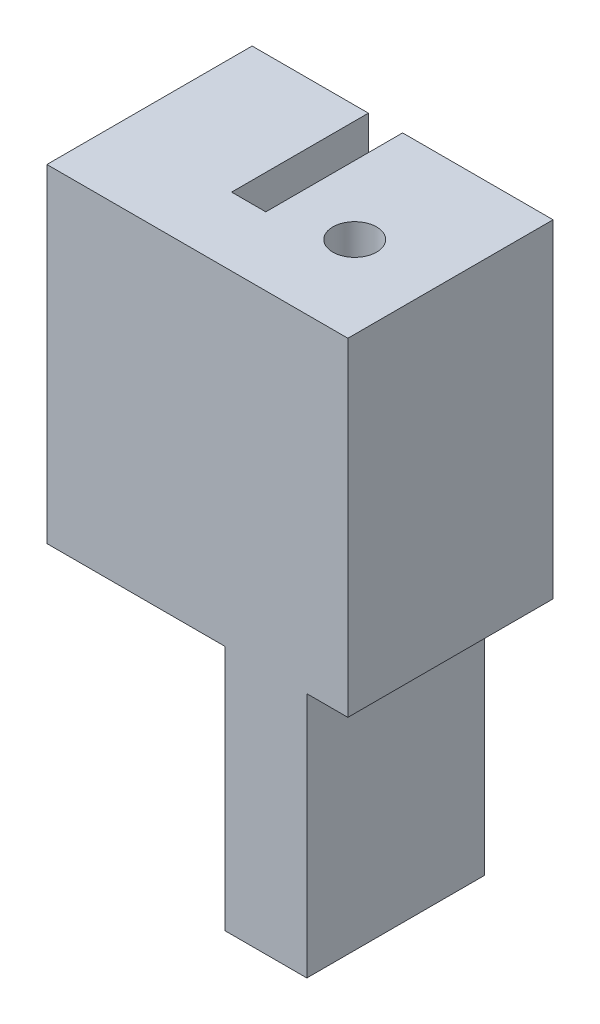
ISO-10303-21;
HEADER;
FILE_DESCRIPTION(('STEP AP214'),'2;1');
FILE_NAME('part.step','',(''),(''),'','','');
FILE_SCHEMA(('AUTOMOTIVE_DESIGN { 1 0 10303 214 1 1 1 1 }'));
ENDSEC;
DATA;
#1=APPLICATION_CONTEXT('core data for automotive mechanical design processes');
#2=APPLICATION_PROTOCOL_DEFINITION('international standard','automotive_design',2000,#1);
#3=PRODUCT_CONTEXT('',#1,'mechanical');
#4=PRODUCT('Part','Part','',(#3));
#5=PRODUCT_RELATED_PRODUCT_CATEGORY('part','',(#4));
#6=PRODUCT_DEFINITION_FORMATION('','',#4);
#7=PRODUCT_DEFINITION_CONTEXT('part definition',#1,'design');
#8=PRODUCT_DEFINITION('design','',#6,#7);
#9=PRODUCT_DEFINITION_SHAPE('','',#8);
#10=(LENGTH_UNIT() NAMED_UNIT(*) SI_UNIT(.MILLI.,.METRE.));
#11=(NAMED_UNIT(*) PLANE_ANGLE_UNIT() SI_UNIT($,.RADIAN.));
#12=(NAMED_UNIT(*) SI_UNIT($,.STERADIAN.) SOLID_ANGLE_UNIT());
#13=UNCERTAINTY_MEASURE_WITH_UNIT(LENGTH_MEASURE(1.E-05),#10,'distance_accuracy_value','');
#14=(GEOMETRIC_REPRESENTATION_CONTEXT(3) GLOBAL_UNCERTAINTY_ASSIGNED_CONTEXT((#13)) GLOBAL_UNIT_ASSIGNED_CONTEXT((#10,
#11,#12)) REPRESENTATION_CONTEXT('',''));
#15=CARTESIAN_POINT('',(0.,0.,0.));
#16=DIRECTION('',(0.,0.,1.));
#17=DIRECTION('',(1.,0.,0.));
#18=AXIS2_PLACEMENT_3D('',#15,#16,#17);
#19=CARTESIAN_POINT('',(-23.5,24.,8.5));
#20=DIRECTION('',(0.,-1.,0.));
#21=DIRECTION('',(0.,0.,-1.));
#22=AXIS2_PLACEMENT_3D('',#19,#20,#21);
#23=CYLINDRICAL_SURFACE('',#22,1.6);
#24=CARTESIAN_POINT('',(-23.5,4.64999999999999,8.5));
#25=DIRECTION('',(0.,1.,0.));
#26=DIRECTION('',(-1.,0.,0.));
#27=AXIS2_PLACEMENT_3D('',#24,#25,#26);
#28=CIRCLE('',#27,1.6);
#29=CARTESIAN_POINT('',(-25.1,4.64999999999999,8.5));
#30=VERTEX_POINT('',#29);
#31=EDGE_CURVE('E39',#30,#30,#28,.F.);
#32=ORIENTED_EDGE('',*,*,#31,.T.);
#33=EDGE_LOOP('',(#32));
#34=FACE_BOUND('',#33,.T.);
#35=CARTESIAN_POINT('',(-23.5,24.,8.5));
#36=DIRECTION('',(0.,-1.,0.));
#37=DIRECTION('',(0.,0.,-1.));
#38=AXIS2_PLACEMENT_3D('',#35,#36,#37);
#39=CIRCLE('',#38,1.6);
#40=CARTESIAN_POINT('',(-23.5,24.,6.9));
#41=VERTEX_POINT('',#40);
#42=EDGE_CURVE('E256',#41,#41,#39,.T.);
#43=ORIENTED_EDGE('',*,*,#42,.F.);
#44=EDGE_LOOP('',(#43));
#45=FACE_BOUND('',#44,.T.);
#46=ADVANCED_FACE('F35',(#34,#45),#23,.F.);
#47=CARTESIAN_POINT('',(-26.5,-18.,2.));
#48=DIRECTION('',(0.,0.,-1.));
#49=DIRECTION('',(-1.,0.,0.));
#50=AXIS2_PLACEMENT_3D('',#47,#48,#49);
#51=PLANE('',#50);
#52=DIRECTION('',(0.,1.,0.));
#53=VECTOR('',#52,1.);
#54=CARTESIAN_POINT('',(-26.5,-18.,2.));
#55=LINE('',#54,#53);
#56=CARTESIAN_POINT('',(-26.5,-18.,2.));
#57=VERTEX_POINT('',#56);
#58=CARTESIAN_POINT('',(-26.5,0.,2.));
#59=VERTEX_POINT('',#58);
#60=EDGE_CURVE('E276',#57,#59,#55,.T.);
#61=ORIENTED_EDGE('',*,*,#60,.T.);
#62=DIRECTION('',(-1.,0.,0.));
#63=VECTOR('',#62,1.);
#64=CARTESIAN_POINT('',(-26.5,0.,2.));
#65=LINE('',#64,#63);
#66=CARTESIAN_POINT('',(-20.5,0.,2.));
#67=VERTEX_POINT('',#66);
#68=EDGE_CURVE('E259',#67,#59,#65,.T.);
#69=ORIENTED_EDGE('',*,*,#68,.F.);
#70=DIRECTION('',(0.,1.,0.));
#71=VECTOR('',#70,1.);
#72=CARTESIAN_POINT('',(-20.5,-18.,2.));
#73=LINE('',#72,#71);
#74=CARTESIAN_POINT('',(-20.5,-18.,2.));
#75=VERTEX_POINT('',#74);
#76=EDGE_CURVE('E280',#75,#67,#73,.T.);
#77=ORIENTED_EDGE('',*,*,#76,.F.);
#78=DIRECTION('',(-1.,0.,0.));
#79=VECTOR('',#78,1.);
#80=CARTESIAN_POINT('',(-26.5,-18.,2.));
#81=LINE('',#80,#79);
#82=EDGE_CURVE('E272',#75,#57,#81,.T.);
#83=ORIENTED_EDGE('',*,*,#82,.T.);
#84=EDGE_LOOP('',(#61,#69,#77,#83));
#85=FACE_BOUND('',#84,.T.);
#86=ADVANCED_FACE('F424',(#85),#51,.T.);
#87=CARTESIAN_POINT('',(0.,0.,10.));
#88=DIRECTION('',(0.,0.,-1.));
#89=DIRECTION('',(-1.,0.,0.));
#90=AXIS2_PLACEMENT_3D('',#87,#88,#89);
#91=PLANE('',#90);
#92=DIRECTION('',(0.890531972902746,0.454920658178921,0.));
#93=VECTOR('',#92,1.);
#94=CARTESIAN_POINT('',(-31.,13.19,10.));
#95=LINE('',#94,#93);
#96=CARTESIAN_POINT('',(-36.71,10.2730952315675,10.));
#97=VERTEX_POINT('',#96);
#98=CARTESIAN_POINT('',(-31.,13.19,10.));
#99=VERTEX_POINT('',#98);
#100=EDGE_CURVE('E320',#97,#99,#95,.T.);
#101=ORIENTED_EDGE('',*,*,#100,.T.);
#102=DIRECTION('',(0.,1.,0.));
#103=VECTOR('',#102,1.);
#104=CARTESIAN_POINT('',(-31.,24.,10.));
#105=LINE('',#104,#103);
#106=CARTESIAN_POINT('',(-31.,24.,10.));
#107=VERTEX_POINT('',#106);
#108=EDGE_CURVE('E310',#99,#107,#105,.T.);
#109=ORIENTED_EDGE('',*,*,#108,.T.);
#110=DIRECTION('',(-1.,0.,0.));
#111=VECTOR('',#110,1.);
#112=CARTESIAN_POINT('',(-26.5,24.,10.));
#113=LINE('',#112,#111);
#114=CARTESIAN_POINT('',(-28.5,24.,10.));
#115=VERTEX_POINT('',#114);
#116=EDGE_CURVE('E350',#115,#107,#113,.T.);
#117=ORIENTED_EDGE('',*,*,#116,.F.);
#118=DIRECTION('',(0.,-1.,0.));
#119=VECTOR('',#118,1.);
#120=CARTESIAN_POINT('',(-28.5,24.,10.));
#121=LINE('',#120,#119);
#122=CARTESIAN_POINT('',(-28.5,6.02762910915523,10.));
#123=VERTEX_POINT('',#122);
#124=EDGE_CURVE('E371',#115,#123,#121,.T.);
#125=ORIENTED_EDGE('',*,*,#124,.T.);
#126=CARTESIAN_POINT('',(-34.5,6.02762910915523,10.));
#127=DIRECTION('',(0.,0.,-1.));
#128=DIRECTION('',(1.,0.,0.));
#129=AXIS2_PLACEMENT_3D('',#126,#127,#128);
#130=CIRCLE('',#129,6.);
#131=CARTESIAN_POINT('',(-31.0158371040724,1.14289688367537,10.));
#132=VERTEX_POINT('',#131);
#133=EDGE_CURVE('E374',#123,#132,#130,.T.);
#134=ORIENTED_EDGE('',*,*,#133,.T.);
#135=DIRECTION('',(-0.814122037579976,-0.580693815987933,0.));
#136=VECTOR('',#135,1.);
#137=CARTESIAN_POINT('',(-31.0158371040724,1.14289688367537,10.));
#138=LINE('',#137,#136);
#139=CARTESIAN_POINT('',(-32.618157490589,0.,10.));
#140=VERTEX_POINT('',#139);
#141=EDGE_CURVE('E378',#132,#140,#138,.T.);
#142=ORIENTED_EDGE('',*,*,#141,.T.);
#143=DIRECTION('',(1.,0.,0.));
#144=VECTOR('',#143,1.);
#145=CARTESIAN_POINT('',(-26.5,0.,10.));
#146=LINE('',#145,#144);
#147=CARTESIAN_POINT('',(-39.5,0.,10.));
#148=VERTEX_POINT('',#147);
#149=EDGE_CURVE('E354',#148,#140,#146,.T.);
#150=ORIENTED_EDGE('',*,*,#149,.F.);
#151=DIRECTION('',(0.,-1.,0.));
#152=VECTOR('',#151,1.);
#153=CARTESIAN_POINT('',(-39.5,24.,10.));
#154=LINE('',#153,#152);
#155=CARTESIAN_POINT('',(-39.5,6.3625514944793,10.));
#156=VERTEX_POINT('',#155);
#157=EDGE_CURVE('E362',#156,#148,#154,.T.);
#158=ORIENTED_EDGE('',*,*,#157,.F.);
#159=DIRECTION('',(0.434665046367225,0.900592192652467,0.));
#160=VECTOR('',#159,1.);
#161=CARTESIAN_POINT('',(-38.4926861378942,8.4496275254254,10.));
#162=LINE('',#161,#160);
#163=CARTESIAN_POINT('',(-38.4926861378942,8.4496275254254,10.));
#164=VERTEX_POINT('',#163);
#165=EDGE_CURVE('E313',#156,#164,#162,.T.);
#166=ORIENTED_EDGE('',*,*,#165,.T.);
#167=CARTESIAN_POINT('',(-34.8903173672843,6.71096733995649,10.));
#168=DIRECTION('',(0.,0.,-1.));
#169=DIRECTION('',(1.,0.,0.));
#170=AXIS2_PLACEMENT_3D('',#167,#168,#169);
#171=CIRCLE('',#170,4.);
#172=EDGE_CURVE('E317',#164,#97,#171,.T.);
#173=ORIENTED_EDGE('',*,*,#172,.T.);
#174=EDGE_LOOP('',(#101,#109,#117,#125,#134,#142,#150,#158,#166,#173));
#175=FACE_BOUND('',#174,.T.);
#176=DIRECTION('',(-0.890531972902747,-0.45492065817892,0.));
#177=VECTOR('',#176,1.);
#178=CARTESIAN_POINT('',(-30.2,11.6897018477597,10.));
#179=LINE('',#178,#177);
#180=CARTESIAN_POINT('',(-30.2,11.6897018477597,10.));
#181=VERTEX_POINT('',#180);
#182=CARTESIAN_POINT('',(-35.6850508813345,8.88771041678606,10.));
#183=VERTEX_POINT('',#182);
#184=EDGE_CURVE('E293',#181,#183,#179,.T.);
#185=ORIENTED_EDGE('',*,*,#184,.T.);
#186=CARTESIAN_POINT('',(-33.97,5.5304048789427,10.));
#187=DIRECTION('',(0.,0.,1.));
#188=DIRECTION('',(1.,0.,0.));
#189=AXIS2_PLACEMENT_3D('',#186,#187,#188);
#190=CIRCLE('',#189,3.77000000000001);
#191=CARTESIAN_POINT('',(-30.2,5.53040487894271,10.));
#192=VERTEX_POINT('',#191);
#193=EDGE_CURVE('E60',#183,#192,#190,.T.);
#194=ORIENTED_EDGE('',*,*,#193,.T.);
#195=DIRECTION('',(0.,1.,0.));
#196=VECTOR('',#195,1.);
#197=CARTESIAN_POINT('',(-30.2,5.53040487894271,10.));
#198=LINE('',#197,#196);
#199=EDGE_CURVE('E289',#192,#181,#198,.T.);
#200=ORIENTED_EDGE('',*,*,#199,.T.);
#201=EDGE_LOOP('',(#185,#194,#200));
#202=FACE_BOUND('',#201,.T.);
#203=ADVANCED_FACE('F429',(#175,#202),#91,.T.);
#204=CARTESIAN_POINT('',(-26.5,24.,10.));
#205=DIRECTION('',(0.,-1.,0.));
#206=DIRECTION('',(0.,0.,-1.));
#207=AXIS2_PLACEMENT_3D('',#204,#205,#206);
#208=PLANE('',#207);
#209=ORIENTED_EDGE('',*,*,#42,.T.);
#210=EDGE_LOOP('',(#209));
#211=FACE_BOUND('',#210,.T.);
#212=DIRECTION('',(-1.,0.,0.));
#213=VECTOR('',#212,1.);
#214=CARTESIAN_POINT('',(-26.5,24.,15.));
#215=LINE('',#214,#213);
#216=CARTESIAN_POINT('',(-17.5,24.,15.));
#217=VERTEX_POINT('',#216);
#218=CARTESIAN_POINT('',(-39.5,24.,15.));
#219=VERTEX_POINT('',#218);
#220=EDGE_CURVE('E351',#217,#219,#215,.T.);
#221=ORIENTED_EDGE('',*,*,#220,.F.);
#222=DIRECTION('',(0.,0.,1.));
#223=VECTOR('',#222,1.);
#224=CARTESIAN_POINT('',(-17.5,24.,0.));
#225=LINE('',#224,#223);
#226=CARTESIAN_POINT('',(-17.5,24.,0.));
#227=VERTEX_POINT('',#226);
#228=EDGE_CURVE('E243',#227,#217,#225,.T.);
#229=ORIENTED_EDGE('',*,*,#228,.F.);
#230=DIRECTION('',(-1.,0.,0.));
#231=VECTOR('',#230,1.);
#232=CARTESIAN_POINT('',(-26.5,24.,0.));
#233=LINE('',#232,#231);
#234=CARTESIAN_POINT('',(-28.5,24.,0.));
#235=VERTEX_POINT('',#234);
#236=EDGE_CURVE('E370',#227,#235,#233,.T.);
#237=ORIENTED_EDGE('',*,*,#236,.T.);
#238=DIRECTION('',(0.,0.,-1.));
#239=VECTOR('',#238,1.);
#240=CARTESIAN_POINT('',(-28.5,24.,10.));
#241=LINE('',#240,#239);
#242=EDGE_CURVE('E11',#115,#235,#241,.T.);
#243=ORIENTED_EDGE('',*,*,#242,.F.);
#244=ORIENTED_EDGE('',*,*,#116,.T.);
#245=DIRECTION('',(0.,0.,-1.));
#246=VECTOR('',#245,1.);
#247=CARTESIAN_POINT('',(-31.,24.,10.));
#248=LINE('',#247,#246);
#249=CARTESIAN_POINT('',(-31.,24.,0.));
#250=VERTEX_POINT('',#249);
#251=EDGE_CURVE('E347',#107,#250,#248,.T.);
#252=ORIENTED_EDGE('',*,*,#251,.T.);
#253=DIRECTION('',(-1.,0.,0.));
#254=VECTOR('',#253,1.);
#255=CARTESIAN_POINT('',(-31.,24.,0.));
#256=LINE('',#255,#254);
#257=CARTESIAN_POINT('',(-39.5,24.,0.));
#258=VERTEX_POINT('',#257);
#259=EDGE_CURVE('E326',#250,#258,#256,.T.);
#260=ORIENTED_EDGE('',*,*,#259,.T.);
#261=DIRECTION('',(0.,0.,-1.));
#262=VECTOR('',#261,1.);
#263=CARTESIAN_POINT('',(-39.5,24.,15.));
#264=LINE('',#263,#262);
#265=EDGE_CURVE('E368',#219,#258,#264,.T.);
#266=ORIENTED_EDGE('',*,*,#265,.F.);
#267=EDGE_LOOP('',(#221,#229,#237,#243,#244,#252,#260,#266));
#268=FACE_BOUND('',#267,.T.);
#269=ADVANCED_FACE('F37',(#211,#268),#208,.F.);
#270=CARTESIAN_POINT('',(-28.5,24.,10.));
#271=DIRECTION('',(1.,0.,0.));
#272=DIRECTION('',(0.,1.,0.));
#273=AXIS2_PLACEMENT_3D('',#270,#271,#272);
#274=PLANE('',#273);
#275=DIRECTION('',(0.,-1.,0.));
#276=VECTOR('',#275,1.);
#277=CARTESIAN_POINT('',(-28.5,24.,0.));
#278=LINE('',#277,#276);
#279=CARTESIAN_POINT('',(-28.5,6.02762910915523,0.));
#280=VERTEX_POINT('',#279);
#281=EDGE_CURVE('E383',#235,#280,#278,.T.);
#282=ORIENTED_EDGE('',*,*,#281,.T.);
#283=DIRECTION('',(0.,0.,-1.));
#284=VECTOR('',#283,1.);
#285=CARTESIAN_POINT('',(-28.5,6.02762910915523,10.));
#286=LINE('',#285,#284);
#287=EDGE_CURVE('E44',#123,#280,#286,.T.);
#288=ORIENTED_EDGE('',*,*,#287,.F.);
#289=ORIENTED_EDGE('',*,*,#124,.F.);
#290=ORIENTED_EDGE('',*,*,#242,.T.);
#291=EDGE_LOOP('',(#282,#288,#289,#290));
#292=FACE_BOUND('',#291,.T.);
#293=ADVANCED_FACE('F483',(#292),#274,.F.);
#294=CARTESIAN_POINT('',(-34.5,6.02762910915523,10.));
#295=DIRECTION('',(0.,0.,-1.));
#296=DIRECTION('',(-1.,0.,0.));
#297=AXIS2_PLACEMENT_3D('',#294,#295,#296);
#298=CYLINDRICAL_SURFACE('',#297,6.);
#299=CARTESIAN_POINT('',(-34.5,6.02762910915523,0.));
#300=DIRECTION('',(0.,0.,-1.));
#301=DIRECTION('',(1.,0.,0.));
#302=AXIS2_PLACEMENT_3D('',#299,#300,#301);
#303=CIRCLE('',#302,6.);
#304=CARTESIAN_POINT('',(-31.0158371040724,1.14289688367537,0.));
#305=VERTEX_POINT('',#304);
#306=EDGE_CURVE('E385',#280,#305,#303,.T.);
#307=ORIENTED_EDGE('',*,*,#306,.T.);
#308=DIRECTION('',(0.,0.,-1.));
#309=VECTOR('',#308,1.);
#310=CARTESIAN_POINT('',(-31.0158371040724,1.14289688367537,10.));
#311=LINE('',#310,#309);
#312=EDGE_CURVE('E396',#132,#305,#311,.T.);
#313=ORIENTED_EDGE('',*,*,#312,.F.);
#314=ORIENTED_EDGE('',*,*,#133,.F.);
#315=ORIENTED_EDGE('',*,*,#287,.T.);
#316=EDGE_LOOP('',(#307,#313,#314,#315));
#317=FACE_BOUND('',#316,.T.);
#318=ADVANCED_FACE('F486',(#317),#298,.F.);
#319=CARTESIAN_POINT('',(-31.0158371040724,1.14289688367537,10.));
#320=DIRECTION('',(0.580693815987933,-0.814122037579976,0.));
#321=DIRECTION('',(0.814122037579976,0.580693815987933,0.));
#322=AXIS2_PLACEMENT_3D('',#319,#320,#321);
#323=PLANE('',#322);
#324=DIRECTION('',(-0.814122037579976,-0.580693815987933,0.));
#325=VECTOR('',#324,1.);
#326=CARTESIAN_POINT('',(-31.0158371040724,1.14289688367537,0.));
#327=LINE('',#326,#325);
#328=CARTESIAN_POINT('',(-32.618157490589,0.,0.));
#329=VERTEX_POINT('',#328);
#330=EDGE_CURVE('E387',#305,#329,#327,.T.);
#331=ORIENTED_EDGE('',*,*,#330,.T.);
#332=DIRECTION('',(0.,0.,-1.));
#333=VECTOR('',#332,1.);
#334=CARTESIAN_POINT('',(-32.618157490589,0.,10.));
#335=LINE('',#334,#333);
#336=EDGE_CURVE('E393',#140,#329,#335,.T.);
#337=ORIENTED_EDGE('',*,*,#336,.F.);
#338=ORIENTED_EDGE('',*,*,#141,.F.);
#339=ORIENTED_EDGE('',*,*,#312,.T.);
#340=EDGE_LOOP('',(#331,#337,#338,#339));
#341=FACE_BOUND('',#340,.T.);
#342=ADVANCED_FACE('F476',(#341),#323,.F.);
#343=CARTESIAN_POINT('',(-26.5,0.,10.));
#344=DIRECTION('',(0.,1.,0.));
#345=DIRECTION('',(-1.,0.,0.));
#346=AXIS2_PLACEMENT_3D('',#343,#344,#345);
#347=PLANE('',#346);
#348=DIRECTION('',(1.,0.,0.));
#349=VECTOR('',#348,1.);
#350=CARTESIAN_POINT('',(-26.5,0.,0.));
#351=LINE('',#350,#349);
#352=CARTESIAN_POINT('',(-17.5,0.,0.));
#353=VERTEX_POINT('',#352);
#354=EDGE_CURVE('E375',#329,#353,#351,.T.);
#355=ORIENTED_EDGE('',*,*,#354,.T.);
#356=DIRECTION('',(0.,0.,-1.));
#357=VECTOR('',#356,1.);
#358=CARTESIAN_POINT('',(-17.5,0.,0.));
#359=LINE('',#358,#357);
#360=CARTESIAN_POINT('',(-17.5,0.,15.));
#361=VERTEX_POINT('',#360);
#362=EDGE_CURVE('E249',#361,#353,#359,.T.);
#363=ORIENTED_EDGE('',*,*,#362,.F.);
#364=DIRECTION('',(-1.,0.,0.));
#365=VECTOR('',#364,1.);
#366=CARTESIAN_POINT('',(-17.5,0.,15.));
#367=LINE('',#366,#365);
#368=CARTESIAN_POINT('',(-20.5,0.,15.));
#369=VERTEX_POINT('',#368);
#370=EDGE_CURVE('E252',#361,#369,#367,.T.);
#371=ORIENTED_EDGE('',*,*,#370,.T.);
#372=DIRECTION('',(0.,0.,-1.));
#373=VECTOR('',#372,1.);
#374=CARTESIAN_POINT('',(-20.5,0.,0.));
#375=LINE('',#374,#373);
#376=EDGE_CURVE('E244',#369,#67,#375,.T.);
#377=ORIENTED_EDGE('',*,*,#376,.T.);
#378=ORIENTED_EDGE('',*,*,#68,.T.);
#379=DIRECTION('',(0.,0.,-1.));
#380=VECTOR('',#379,1.);
#381=CARTESIAN_POINT('',(-26.5,0.,10.));
#382=LINE('',#381,#380);
#383=CARTESIAN_POINT('',(-26.5,0.,15.));
#384=VERTEX_POINT('',#383);
#385=EDGE_CURVE('E381',#384,#59,#382,.T.);
#386=ORIENTED_EDGE('',*,*,#385,.F.);
#387=DIRECTION('',(1.,0.,0.));
#388=VECTOR('',#387,1.);
#389=CARTESIAN_POINT('',(-26.5,0.,15.));
#390=LINE('',#389,#388);
#391=CARTESIAN_POINT('',(-39.5,0.,15.));
#392=VERTEX_POINT('',#391);
#393=EDGE_CURVE('E356',#392,#384,#390,.T.);
#394=ORIENTED_EDGE('',*,*,#393,.F.);
#395=DIRECTION('',(0.,0.,-1.));
#396=VECTOR('',#395,1.);
#397=CARTESIAN_POINT('',(-39.5,0.,15.));
#398=LINE('',#397,#396);
#399=EDGE_CURVE('E359',#392,#148,#398,.T.);
#400=ORIENTED_EDGE('',*,*,#399,.T.);
#401=ORIENTED_EDGE('',*,*,#149,.T.);
#402=ORIENTED_EDGE('',*,*,#336,.T.);
#403=EDGE_LOOP('',(#355,#363,#371,#377,#378,#386,#394,#400,#401,#402));
#404=FACE_BOUND('',#403,.T.);
#405=ADVANCED_FACE('F457',(#404),#347,.F.);
#406=CARTESIAN_POINT('',(-34.5,6.02762910915523,0.));
#407=DIRECTION('',(0.,0.,1.));
#408=DIRECTION('',(1.,0.,0.));
#409=AXIS2_PLACEMENT_3D('',#406,#407,#408);
#410=PLANE('',#409);
#411=DIRECTION('',(-1.,0.,0.));
#412=VECTOR('',#411,1.);
#413=CARTESIAN_POINT('',(-20.625,1.99999999999999,0.));
#414=LINE('',#413,#412);
#415=CARTESIAN_POINT('',(-20.625,1.99999999999999,0.));
#416=VERTEX_POINT('',#415);
#417=CARTESIAN_POINT('',(-26.375,1.99999999999999,0.));
#418=VERTEX_POINT('',#417);
#419=EDGE_CURVE('E230',#416,#418,#414,.T.);
#420=ORIENTED_EDGE('',*,*,#419,.F.);
#421=DIRECTION('',(0.,-1.,0.));
#422=VECTOR('',#421,1.);
#423=CARTESIAN_POINT('',(-20.625,1.99999999999999,0.));
#424=LINE('',#423,#422);
#425=CARTESIAN_POINT('',(-20.625,4.64999999999999,0.));
#426=VERTEX_POINT('',#425);
#427=EDGE_CURVE('E52',#426,#416,#424,.T.);
#428=ORIENTED_EDGE('',*,*,#427,.F.);
#429=DIRECTION('',(1.,0.,0.));
#430=VECTOR('',#429,1.);
#431=CARTESIAN_POINT('',(-20.625,4.64999999999999,0.));
#432=LINE('',#431,#430);
#433=CARTESIAN_POINT('',(-26.375,4.64999999999999,0.));
#434=VERTEX_POINT('',#433);
#435=EDGE_CURVE('E221',#434,#426,#432,.T.);
#436=ORIENTED_EDGE('',*,*,#435,.F.);
#437=DIRECTION('',(0.,1.,0.));
#438=VECTOR('',#437,1.);
#439=CARTESIAN_POINT('',(-26.375,1.99999999999999,0.));
#440=LINE('',#439,#438);
#441=EDGE_CURVE('E224',#418,#434,#440,.T.);
#442=ORIENTED_EDGE('',*,*,#441,.F.);
#443=EDGE_LOOP('',(#420,#428,#436,#442));
#444=FACE_BOUND('',#443,.T.);
#445=ORIENTED_EDGE('',*,*,#236,.F.);
#446=DIRECTION('',(0.,1.,0.));
#447=VECTOR('',#446,1.);
#448=CARTESIAN_POINT('',(-17.5,0.,0.));
#449=LINE('',#448,#447);
#450=EDGE_CURVE('E240',#353,#227,#449,.T.);
#451=ORIENTED_EDGE('',*,*,#450,.F.);
#452=ORIENTED_EDGE('',*,*,#354,.F.);
#453=ORIENTED_EDGE('',*,*,#330,.F.);
#454=ORIENTED_EDGE('',*,*,#306,.F.);
#455=ORIENTED_EDGE('',*,*,#281,.F.);
#456=EDGE_LOOP('',(#445,#451,#452,#453,#454,#455));
#457=FACE_BOUND('',#456,.T.);
#458=ADVANCED_FACE('F479',(#444,#457),#410,.F.);
#459=CARTESIAN_POINT('',(-39.5,24.,15.));
#460=DIRECTION('',(1.,0.,0.));
#461=DIRECTION('',(0.,0.,-1.));
#462=AXIS2_PLACEMENT_3D('',#459,#460,#461);
#463=PLANE('',#462);
#464=ORIENTED_EDGE('',*,*,#265,.T.);
#465=DIRECTION('',(0.,-1.,0.));
#466=VECTOR('',#465,1.);
#467=CARTESIAN_POINT('',(-39.5,6.3625514944793,0.));
#468=LINE('',#467,#466);
#469=CARTESIAN_POINT('',(-39.5,6.3625514944793,0.));
#470=VERTEX_POINT('',#469);
#471=EDGE_CURVE('E329',#258,#470,#468,.T.);
#472=ORIENTED_EDGE('',*,*,#471,.T.);
#473=DIRECTION('',(0.,0.,-1.));
#474=VECTOR('',#473,1.);
#475=CARTESIAN_POINT('',(-39.5,6.3625514944793,10.));
#476=LINE('',#475,#474);
#477=EDGE_CURVE('E344',#156,#470,#476,.T.);
#478=ORIENTED_EDGE('',*,*,#477,.F.);
#479=ORIENTED_EDGE('',*,*,#157,.T.);
#480=ORIENTED_EDGE('',*,*,#399,.F.);
#481=DIRECTION('',(0.,-1.,0.));
#482=VECTOR('',#481,1.);
#483=CARTESIAN_POINT('',(-39.5,24.,15.));
#484=LINE('',#483,#482);
#485=EDGE_CURVE('E353',#219,#392,#484,.T.);
#486=ORIENTED_EDGE('',*,*,#485,.F.);
#487=EDGE_LOOP('',(#464,#472,#478,#479,#480,#486));
#488=FACE_BOUND('',#487,.T.);
#489=ADVANCED_FACE('F468',(#488),#463,.F.);
#490=CARTESIAN_POINT('',(0.,0.,15.));
#491=DIRECTION('',(0.,0.,-1.));
#492=DIRECTION('',(-1.,0.,0.));
#493=AXIS2_PLACEMENT_3D('',#490,#491,#492);
#494=PLANE('',#493);
#495=ORIENTED_EDGE('',*,*,#393,.T.);
#496=DIRECTION('',(0.,1.,0.));
#497=VECTOR('',#496,1.);
#498=CARTESIAN_POINT('',(-26.5,-18.,15.));
#499=LINE('',#498,#497);
#500=CARTESIAN_POINT('',(-26.5,-18.,15.));
#501=VERTEX_POINT('',#500);
#502=EDGE_CURVE('E275',#501,#384,#499,.T.);
#503=ORIENTED_EDGE('',*,*,#502,.F.);
#504=DIRECTION('',(1.,0.,0.));
#505=VECTOR('',#504,1.);
#506=CARTESIAN_POINT('',(-26.5,-18.,15.));
#507=LINE('',#506,#505);
#508=CARTESIAN_POINT('',(-20.5,-18.,15.));
#509=VERTEX_POINT('',#508);
#510=EDGE_CURVE('E266',#501,#509,#507,.T.);
#511=ORIENTED_EDGE('',*,*,#510,.T.);
#512=DIRECTION('',(0.,1.,0.));
#513=VECTOR('',#512,1.);
#514=CARTESIAN_POINT('',(-20.5,-18.,15.));
#515=LINE('',#514,#513);
#516=EDGE_CURVE('E283',#509,#369,#515,.T.);
#517=ORIENTED_EDGE('',*,*,#516,.T.);
#518=ORIENTED_EDGE('',*,*,#370,.F.);
#519=DIRECTION('',(0.,-1.,0.));
#520=VECTOR('',#519,1.);
#521=CARTESIAN_POINT('',(-17.5,0.,15.));
#522=LINE('',#521,#520);
#523=EDGE_CURVE('E247',#217,#361,#522,.T.);
#524=ORIENTED_EDGE('',*,*,#523,.F.);
#525=ORIENTED_EDGE('',*,*,#220,.T.);
#526=ORIENTED_EDGE('',*,*,#485,.T.);
#527=EDGE_LOOP('',(#495,#503,#511,#517,#518,#524,#525,#526));
#528=FACE_BOUND('',#527,.T.);
#529=ADVANCED_FACE('F452',(#528),#494,.F.);
#530=CARTESIAN_POINT('',(-31.,24.,10.));
#531=DIRECTION('',(-1.,0.,0.));
#532=DIRECTION('',(0.,-1.,0.));
#533=AXIS2_PLACEMENT_3D('',#530,#531,#532);
#534=PLANE('',#533);
#535=DIRECTION('',(0.,1.,0.));
#536=VECTOR('',#535,1.);
#537=CARTESIAN_POINT('',(-31.,24.,0.));
#538=LINE('',#537,#536);
#539=CARTESIAN_POINT('',(-31.,13.19,0.));
#540=VERTEX_POINT('',#539);
#541=EDGE_CURVE('E309',#540,#250,#538,.T.);
#542=ORIENTED_EDGE('',*,*,#541,.T.);
#543=ORIENTED_EDGE('',*,*,#251,.F.);
#544=ORIENTED_EDGE('',*,*,#108,.F.);
#545=DIRECTION('',(0.,0.,-1.));
#546=VECTOR('',#545,1.);
#547=CARTESIAN_POINT('',(-31.,13.19,10.));
#548=LINE('',#547,#546);
#549=EDGE_CURVE('E323',#99,#540,#548,.T.);
#550=ORIENTED_EDGE('',*,*,#549,.T.);
#551=EDGE_LOOP('',(#542,#543,#544,#550));
#552=FACE_BOUND('',#551,.T.);
#553=ADVANCED_FACE('F490',(#552),#534,.F.);
#554=CARTESIAN_POINT('',(-38.4926861378942,8.4496275254254,10.));
#555=DIRECTION('',(-0.900592192652467,0.434665046367225,0.));
#556=DIRECTION('',(-0.434665046367225,-0.900592192652467,0.));
#557=AXIS2_PLACEMENT_3D('',#554,#555,#556);
#558=PLANE('',#557);
#559=DIRECTION('',(0.434665046367225,0.900592192652467,0.));
#560=VECTOR('',#559,1.);
#561=CARTESIAN_POINT('',(-38.4926861378942,8.4496275254254,0.));
#562=LINE('',#561,#560);
#563=CARTESIAN_POINT('',(-38.4926861378942,8.4496275254254,0.));
#564=VERTEX_POINT('',#563);
#565=EDGE_CURVE('E331',#470,#564,#562,.T.);
#566=ORIENTED_EDGE('',*,*,#565,.T.);
#567=DIRECTION('',(0.,0.,-1.));
#568=VECTOR('',#567,1.);
#569=CARTESIAN_POINT('',(-38.4926861378942,8.4496275254254,10.));
#570=LINE('',#569,#568);
#571=EDGE_CURVE('E341',#164,#564,#570,.T.);
#572=ORIENTED_EDGE('',*,*,#571,.F.);
#573=ORIENTED_EDGE('',*,*,#165,.F.);
#574=ORIENTED_EDGE('',*,*,#477,.T.);
#575=EDGE_LOOP('',(#566,#572,#573,#574));
#576=FACE_BOUND('',#575,.T.);
#577=ADVANCED_FACE('F499',(#576),#558,.F.);
#578=CARTESIAN_POINT('',(-34.8903173672843,6.71096733995649,10.));
#579=DIRECTION('',(0.,0.,-1.));
#580=DIRECTION('',(-1.,0.,0.));
#581=AXIS2_PLACEMENT_3D('',#578,#579,#580);
#582=CYLINDRICAL_SURFACE('',#581,4.);
#583=CARTESIAN_POINT('',(-34.8903173672843,6.71096733995649,0.));
#584=DIRECTION('',(0.,0.,-1.));
#585=DIRECTION('',(1.,0.,0.));
#586=AXIS2_PLACEMENT_3D('',#583,#584,#585);
#587=CIRCLE('',#586,4.);
#588=CARTESIAN_POINT('',(-36.71,10.2730952315675,0.));
#589=VERTEX_POINT('',#588);
#590=EDGE_CURVE('E333',#564,#589,#587,.T.);
#591=ORIENTED_EDGE('',*,*,#590,.T.);
#592=DIRECTION('',(0.,0.,-1.));
#593=VECTOR('',#592,1.);
#594=CARTESIAN_POINT('',(-36.71,10.2730952315675,10.));
#595=LINE('',#594,#593);
#596=EDGE_CURVE('E338',#97,#589,#595,.T.);
#597=ORIENTED_EDGE('',*,*,#596,.F.);
#598=ORIENTED_EDGE('',*,*,#172,.F.);
#599=ORIENTED_EDGE('',*,*,#571,.T.);
#600=EDGE_LOOP('',(#591,#597,#598,#599));
#601=FACE_BOUND('',#600,.T.);
#602=ADVANCED_FACE('F503',(#601),#582,.F.);
#603=CARTESIAN_POINT('',(-31.,13.19,10.));
#604=DIRECTION('',(-0.454920658178921,0.890531972902746,0.));
#605=DIRECTION('',(-0.890531972902746,-0.454920658178921,0.));
#606=AXIS2_PLACEMENT_3D('',#603,#604,#605);
#607=PLANE('',#606);
#608=DIRECTION('',(0.890531972902746,0.454920658178921,0.));
#609=VECTOR('',#608,1.);
#610=CARTESIAN_POINT('',(-31.,13.19,0.));
#611=LINE('',#610,#609);
#612=EDGE_CURVE('E314',#589,#540,#611,.T.);
#613=ORIENTED_EDGE('',*,*,#612,.T.);
#614=ORIENTED_EDGE('',*,*,#549,.F.);
#615=ORIENTED_EDGE('',*,*,#100,.F.);
#616=ORIENTED_EDGE('',*,*,#596,.T.);
#617=EDGE_LOOP('',(#613,#614,#615,#616));
#618=FACE_BOUND('',#617,.T.);
#619=ADVANCED_FACE('F505',(#618),#607,.F.);
#620=CARTESIAN_POINT('',(-34.8903173672843,6.71096733995649,0.));
#621=DIRECTION('',(0.,0.,1.));
#622=DIRECTION('',(1.,0.,0.));
#623=AXIS2_PLACEMENT_3D('',#620,#621,#622);
#624=PLANE('',#623);
#625=ORIENTED_EDGE('',*,*,#541,.F.);
#626=ORIENTED_EDGE('',*,*,#612,.F.);
#627=ORIENTED_EDGE('',*,*,#590,.F.);
#628=ORIENTED_EDGE('',*,*,#565,.F.);
#629=ORIENTED_EDGE('',*,*,#471,.F.);
#630=ORIENTED_EDGE('',*,*,#259,.F.);
#631=EDGE_LOOP('',(#625,#626,#627,#628,#629,#630));
#632=FACE_BOUND('',#631,.T.);
#633=ADVANCED_FACE('F494',(#632),#624,.F.);
#634=CARTESIAN_POINT('',(-33.97,5.5304048789427,10.));
#635=DIRECTION('',(0.,0.,-1.));
#636=DIRECTION('',(-1.,0.,0.));
#637=AXIS2_PLACEMENT_3D('',#634,#635,#636);
#638=CYLINDRICAL_SURFACE('',#637,3.77000000000001);
#639=CARTESIAN_POINT('',(-33.97,5.5304048789427,0.));
#640=DIRECTION('',(0.,0.,1.));
#641=DIRECTION('',(1.,0.,0.));
#642=AXIS2_PLACEMENT_3D('',#639,#640,#641);
#643=CIRCLE('',#642,3.77000000000001);
#644=CARTESIAN_POINT('',(-35.6850508813345,8.88771041678607,0.));
#645=VERTEX_POINT('',#644);
#646=CARTESIAN_POINT('',(-30.2,5.53040487894271,0.));
#647=VERTEX_POINT('',#646);
#648=EDGE_CURVE('E279',#645,#647,#643,.T.);
#649=ORIENTED_EDGE('',*,*,#648,.T.);
#650=DIRECTION('',(0.,0.,-1.));
#651=VECTOR('',#650,1.);
#652=CARTESIAN_POINT('',(-30.2,5.53040487894271,10.));
#653=LINE('',#652,#651);
#654=EDGE_CURVE('E306',#192,#647,#653,.T.);
#655=ORIENTED_EDGE('',*,*,#654,.F.);
#656=ORIENTED_EDGE('',*,*,#193,.F.);
#657=DIRECTION('',(0.,0.,-1.));
#658=VECTOR('',#657,1.);
#659=CARTESIAN_POINT('',(-35.6850508813345,8.88771041678607,10.));
#660=LINE('',#659,#658);
#661=EDGE_CURVE('E296',#183,#645,#660,.T.);
#662=ORIENTED_EDGE('',*,*,#661,.T.);
#663=EDGE_LOOP('',(#649,#655,#656,#662));
#664=FACE_BOUND('',#663,.T.);
#665=ADVANCED_FACE('F512',(#664),#638,.T.);
#666=CARTESIAN_POINT('',(-30.2,5.53040487894271,10.));
#667=DIRECTION('',(-1.,0.,0.));
#668=DIRECTION('',(0.,0.,1.));
#669=AXIS2_PLACEMENT_3D('',#666,#667,#668);
#670=PLANE('',#669);
#671=DIRECTION('',(0.,1.,0.));
#672=VECTOR('',#671,1.);
#673=CARTESIAN_POINT('',(-30.2,5.53040487894271,0.));
#674=LINE('',#673,#672);
#675=CARTESIAN_POINT('',(-30.2,11.6897018477597,0.));
#676=VERTEX_POINT('',#675);
#677=EDGE_CURVE('E299',#647,#676,#674,.T.);
#678=ORIENTED_EDGE('',*,*,#677,.T.);
#679=DIRECTION('',(0.,0.,-1.));
#680=VECTOR('',#679,1.);
#681=CARTESIAN_POINT('',(-30.2,11.6897018477597,10.));
#682=LINE('',#681,#680);
#683=EDGE_CURVE('E303',#181,#676,#682,.T.);
#684=ORIENTED_EDGE('',*,*,#683,.F.);
#685=ORIENTED_EDGE('',*,*,#199,.F.);
#686=ORIENTED_EDGE('',*,*,#654,.T.);
#687=EDGE_LOOP('',(#678,#684,#685,#686));
#688=FACE_BOUND('',#687,.T.);
#689=ADVANCED_FACE('F590',(#688),#670,.F.);
#690=CARTESIAN_POINT('',(-30.2,11.6897018477597,10.));
#691=DIRECTION('',(0.45492065817892,-0.890531972902747,0.));
#692=DIRECTION('',(0.890531972902747,0.45492065817892,0.));
#693=AXIS2_PLACEMENT_3D('',#690,#691,#692);
#694=PLANE('',#693);
#695=DIRECTION('',(-0.890531972902747,-0.45492065817892,0.));
#696=VECTOR('',#695,1.);
#697=CARTESIAN_POINT('',(-30.2,11.6897018477597,0.));
#698=LINE('',#697,#696);
#699=EDGE_CURVE('E290',#676,#645,#698,.T.);
#700=ORIENTED_EDGE('',*,*,#699,.T.);
#701=ORIENTED_EDGE('',*,*,#661,.F.);
#702=ORIENTED_EDGE('',*,*,#184,.F.);
#703=ORIENTED_EDGE('',*,*,#683,.T.);
#704=EDGE_LOOP('',(#700,#701,#702,#703));
#705=FACE_BOUND('',#704,.T.);
#706=ADVANCED_FACE('F580',(#705),#694,.F.);
#707=CARTESIAN_POINT('',(-33.97,5.5304048789427,0.));
#708=DIRECTION('',(0.,0.,1.));
#709=DIRECTION('',(1.,0.,0.));
#710=AXIS2_PLACEMENT_3D('',#707,#708,#709);
#711=PLANE('',#710);
#712=ORIENTED_EDGE('',*,*,#648,.F.);
#713=ORIENTED_EDGE('',*,*,#699,.F.);
#714=ORIENTED_EDGE('',*,*,#677,.F.);
#715=EDGE_LOOP('',(#712,#713,#714));
#716=FACE_BOUND('',#715,.T.);
#717=ADVANCED_FACE('F570',(#716),#711,.F.);
#718=CARTESIAN_POINT('',(-26.5,-18.,15.));
#719=DIRECTION('',(-1.,0.,0.));
#720=DIRECTION('',(0.,0.,1.));
#721=AXIS2_PLACEMENT_3D('',#718,#719,#720);
#722=PLANE('',#721);
#723=ORIENTED_EDGE('',*,*,#502,.T.);
#724=ORIENTED_EDGE('',*,*,#385,.T.);
#725=ORIENTED_EDGE('',*,*,#60,.F.);
#726=DIRECTION('',(0.,0.,1.));
#727=VECTOR('',#726,1.);
#728=CARTESIAN_POINT('',(-26.5,-18.,15.));
#729=LINE('',#728,#727);
#730=EDGE_CURVE('E263',#57,#501,#729,.T.);
#731=ORIENTED_EDGE('',*,*,#730,.T.);
#732=EDGE_LOOP('',(#723,#724,#725,#731));
#733=FACE_BOUND('',#732,.T.);
#734=ADVANCED_FACE('F455',(#733),#722,.T.);
#735=CARTESIAN_POINT('',(-20.5,-18.,15.));
#736=DIRECTION('',(1.,0.,0.));
#737=DIRECTION('',(0.,0.,-1.));
#738=AXIS2_PLACEMENT_3D('',#735,#736,#737);
#739=PLANE('',#738);
#740=ORIENTED_EDGE('',*,*,#376,.F.);
#741=ORIENTED_EDGE('',*,*,#516,.F.);
#742=DIRECTION('',(0.,0.,-1.));
#743=VECTOR('',#742,1.);
#744=CARTESIAN_POINT('',(-20.5,-18.,15.));
#745=LINE('',#744,#743);
#746=EDGE_CURVE('E269',#509,#75,#745,.T.);
#747=ORIENTED_EDGE('',*,*,#746,.T.);
#748=ORIENTED_EDGE('',*,*,#76,.T.);
#749=EDGE_LOOP('',(#740,#741,#747,#748));
#750=FACE_BOUND('',#749,.T.);
#751=ADVANCED_FACE('F438',(#750),#739,.T.);
#752=CARTESIAN_POINT('',(0.,-18.,0.));
#753=DIRECTION('',(0.,-1.,0.));
#754=DIRECTION('',(0.,0.,-1.));
#755=AXIS2_PLACEMENT_3D('',#752,#753,#754);
#756=PLANE('',#755);
#757=CARTESIAN_POINT('',(-23.5,-18.,8.5));
#758=DIRECTION('',(0.,-1.,0.));
#759=DIRECTION('',(0.,0.,-1.));
#760=AXIS2_PLACEMENT_3D('',#757,#758,#759);
#761=CIRCLE('',#760,1.6);
#762=CARTESIAN_POINT('',(-23.5,-18.,6.9));
#763=VERTEX_POINT('',#762);
#764=EDGE_CURVE('E255',#763,#763,#761,.T.);
#765=ORIENTED_EDGE('',*,*,#764,.F.);
#766=EDGE_LOOP('',(#765));
#767=FACE_BOUND('',#766,.T.);
#768=ORIENTED_EDGE('',*,*,#730,.F.);
#769=ORIENTED_EDGE('',*,*,#82,.F.);
#770=ORIENTED_EDGE('',*,*,#746,.F.);
#771=ORIENTED_EDGE('',*,*,#510,.F.);
#772=EDGE_LOOP('',(#768,#769,#770,#771));
#773=FACE_BOUND('',#772,.T.);
#774=ADVANCED_FACE('F434',(#767,#773),#756,.T.);
#775=CARTESIAN_POINT('',(-23.5,1.99999999999999,8.5));
#776=DIRECTION('',(0.,-1.,0.));
#777=DIRECTION('',(1.,0.,0.));
#778=AXIS2_PLACEMENT_3D('',#775,#776,#777);
#779=CIRCLE('',#778,1.6);
#780=CARTESIAN_POINT('',(-21.9,1.99999999999999,8.5));
#781=VERTEX_POINT('',#780);
#782=EDGE_CURVE('E236',#781,#781,#779,.F.);
#783=ORIENTED_EDGE('',*,*,#782,.T.);
#784=EDGE_LOOP('',(#783));
#785=FACE_BOUND('',#784,.T.);
#786=ORIENTED_EDGE('',*,*,#764,.T.);
#787=EDGE_LOOP('',(#786));
#788=FACE_BOUND('',#787,.T.);
#789=ADVANCED_FACE('F418',(#785,#788),#23,.F.);
#790=CARTESIAN_POINT('',(-17.5,0.,0.));
#791=DIRECTION('',(1.,0.,0.));
#792=DIRECTION('',(0.,0.,-1.));
#793=AXIS2_PLACEMENT_3D('',#790,#791,#792);
#794=PLANE('',#793);
#795=ORIENTED_EDGE('',*,*,#450,.T.);
#796=ORIENTED_EDGE('',*,*,#228,.T.);
#797=ORIENTED_EDGE('',*,*,#523,.T.);
#798=ORIENTED_EDGE('',*,*,#362,.T.);
#799=EDGE_LOOP('',(#795,#796,#797,#798));
#800=FACE_BOUND('',#799,.T.);
#801=ADVANCED_FACE('F410',(#800),#794,.T.);
#802=CARTESIAN_POINT('',(-20.625,4.64999999999999,12.5));
#803=DIRECTION('',(0.,1.,0.));
#804=DIRECTION('',(-1.,0.,0.));
#805=AXIS2_PLACEMENT_3D('',#802,#803,#804);
#806=PLANE('',#805);
#807=ORIENTED_EDGE('',*,*,#435,.T.);
#808=DIRECTION('',(0.,0.,-1.));
#809=VECTOR('',#808,1.);
#810=CARTESIAN_POINT('',(-20.625,4.64999999999999,12.5));
#811=LINE('',#810,#809);
#812=CARTESIAN_POINT('',(-20.625,4.64999999999999,12.5));
#813=VERTEX_POINT('',#812);
#814=EDGE_CURVE('E234',#813,#426,#811,.T.);
#815=ORIENTED_EDGE('',*,*,#814,.F.);
#816=DIRECTION('',(1.,0.,0.));
#817=VECTOR('',#816,1.);
#818=CARTESIAN_POINT('',(-20.625,4.64999999999999,12.5));
#819=LINE('',#818,#817);
#820=CARTESIAN_POINT('',(-26.375,4.64999999999999,12.5));
#821=VERTEX_POINT('',#820);
#822=EDGE_CURVE('E208',#821,#813,#819,.T.);
#823=ORIENTED_EDGE('',*,*,#822,.F.);
#824=DIRECTION('',(0.,0.,-1.));
#825=VECTOR('',#824,1.);
#826=CARTESIAN_POINT('',(-26.375,4.64999999999999,12.5));
#827=LINE('',#826,#825);
#828=EDGE_CURVE('E237',#821,#434,#827,.T.);
#829=ORIENTED_EDGE('',*,*,#828,.T.);
#830=EDGE_LOOP('',(#807,#815,#823,#829));
#831=FACE_BOUND('',#830,.T.);
#832=ORIENTED_EDGE('',*,*,#31,.F.);
#833=EDGE_LOOP('',(#832));
#834=FACE_BOUND('',#833,.T.);
#835=ADVANCED_FACE('F408',(#831,#834),#806,.F.);
#836=CARTESIAN_POINT('',(-20.625,1.99999999999999,12.5));
#837=DIRECTION('',(0.,-1.,0.));
#838=DIRECTION('',(1.,0.,0.));
#839=AXIS2_PLACEMENT_3D('',#836,#837,#838);
#840=PLANE('',#839);
#841=ORIENTED_EDGE('',*,*,#419,.T.);
#842=DIRECTION('',(0.,0.,-1.));
#843=VECTOR('',#842,1.);
#844=CARTESIAN_POINT('',(-26.375,1.99999999999999,12.5));
#845=LINE('',#844,#843);
#846=CARTESIAN_POINT('',(-26.375,1.99999999999999,12.5));
#847=VERTEX_POINT('',#846);
#848=EDGE_CURVE('E207',#847,#418,#845,.T.);
#849=ORIENTED_EDGE('',*,*,#848,.F.);
#850=DIRECTION('',(-1.,0.,0.));
#851=VECTOR('',#850,1.);
#852=CARTESIAN_POINT('',(-20.625,1.99999999999999,12.5));
#853=LINE('',#852,#851);
#854=CARTESIAN_POINT('',(-20.625,1.99999999999999,12.5));
#855=VERTEX_POINT('',#854);
#856=EDGE_CURVE('E211',#855,#847,#853,.T.);
#857=ORIENTED_EDGE('',*,*,#856,.F.);
#858=DIRECTION('',(0.,0.,-1.));
#859=VECTOR('',#858,1.);
#860=CARTESIAN_POINT('',(-20.625,1.99999999999999,12.5));
#861=LINE('',#860,#859);
#862=EDGE_CURVE('E198',#855,#416,#861,.T.);
#863=ORIENTED_EDGE('',*,*,#862,.T.);
#864=EDGE_LOOP('',(#841,#849,#857,#863));
#865=FACE_BOUND('',#864,.T.);
#866=ORIENTED_EDGE('',*,*,#782,.F.);
#867=EDGE_LOOP('',(#866));
#868=FACE_BOUND('',#867,.T.);
#869=ADVANCED_FACE('F212',(#865,#868),#840,.F.);
#870=CARTESIAN_POINT('',(-20.625,1.99999999999999,12.5));
#871=DIRECTION('',(1.,0.,0.));
#872=DIRECTION('',(0.,1.,0.));
#873=AXIS2_PLACEMENT_3D('',#870,#871,#872);
#874=PLANE('',#873);
#875=ORIENTED_EDGE('',*,*,#427,.T.);
#876=ORIENTED_EDGE('',*,*,#862,.F.);
#877=DIRECTION('',(0.,-1.,0.));
#878=VECTOR('',#877,1.);
#879=CARTESIAN_POINT('',(-20.625,1.99999999999999,12.5));
#880=LINE('',#879,#878);
#881=EDGE_CURVE('E202',#813,#855,#880,.T.);
#882=ORIENTED_EDGE('',*,*,#881,.F.);
#883=ORIENTED_EDGE('',*,*,#814,.T.);
#884=EDGE_LOOP('',(#875,#876,#882,#883));
#885=FACE_BOUND('',#884,.T.);
#886=ADVANCED_FACE('F200',(#885),#874,.F.);
#887=CARTESIAN_POINT('',(-26.375,1.99999999999999,12.5));
#888=DIRECTION('',(-1.,0.,0.));
#889=DIRECTION('',(0.,-1.,0.));
#890=AXIS2_PLACEMENT_3D('',#887,#888,#889);
#891=PLANE('',#890);
#892=ORIENTED_EDGE('',*,*,#441,.T.);
#893=ORIENTED_EDGE('',*,*,#828,.F.);
#894=DIRECTION('',(0.,1.,0.));
#895=VECTOR('',#894,1.);
#896=CARTESIAN_POINT('',(-26.375,1.99999999999999,12.5));
#897=LINE('',#896,#895);
#898=EDGE_CURVE('E217',#847,#821,#897,.T.);
#899=ORIENTED_EDGE('',*,*,#898,.F.);
#900=ORIENTED_EDGE('',*,*,#848,.T.);
#901=EDGE_LOOP('',(#892,#893,#899,#900));
#902=FACE_BOUND('',#901,.T.);
#903=ADVANCED_FACE('F741',(#902),#891,.F.);
#904=CARTESIAN_POINT('',(0.,0.,12.5));
#905=DIRECTION('',(0.,0.,1.));
#906=DIRECTION('',(1.,0.,0.));
#907=AXIS2_PLACEMENT_3D('',#904,#905,#906);
#908=PLANE('',#907);
#909=ORIENTED_EDGE('',*,*,#881,.T.);
#910=ORIENTED_EDGE('',*,*,#856,.T.);
#911=ORIENTED_EDGE('',*,*,#898,.T.);
#912=ORIENTED_EDGE('',*,*,#822,.T.);
#913=EDGE_LOOP('',(#909,#910,#911,#912));
#914=FACE_BOUND('',#913,.T.);
#915=ADVANCED_FACE('F219',(#914),#908,.F.);
#916=CLOSED_SHELL('',(#46,#86,#203,#269,#293,#318,#342,#405,#458,#489,#529,#553,#577,#602,#619,
#633,#665,#689,#706,#717,#734,#751,#774,#789,#801,#835,#869,#886,#903,#915));
#917=MANIFOLD_SOLID_BREP('B2',#916);
#918=ADVANCED_BREP_SHAPE_REPRESENTATION('',(#18,#917),#14);
#919=SHAPE_DEFINITION_REPRESENTATION(#9,#918);
ENDSEC;
END-ISO-10303-21;
